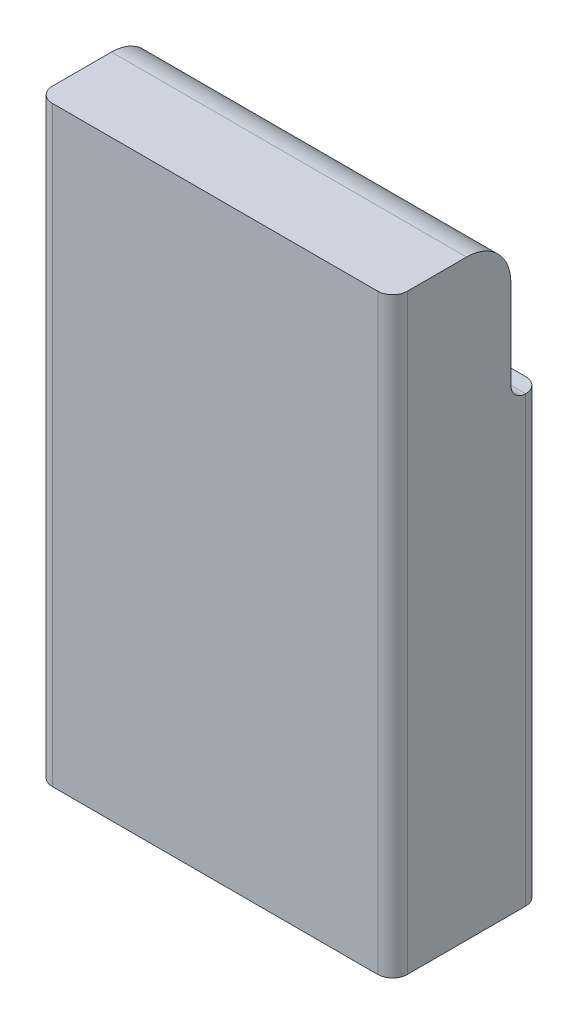
ISO-10303-21;
HEADER;
FILE_DESCRIPTION(('STEP AP214'),'2;1');
FILE_NAME('part.step','',(''),(''),'','','');
FILE_SCHEMA(('AUTOMOTIVE_DESIGN { 1 0 10303 214 1 1 1 1 }'));
ENDSEC;
DATA;
#1=APPLICATION_CONTEXT('core data for automotive mechanical design processes');
#2=APPLICATION_PROTOCOL_DEFINITION('international standard','automotive_design',2000,#1);
#3=PRODUCT_CONTEXT('',#1,'mechanical');
#4=PRODUCT('Part','Part','',(#3));
#5=PRODUCT_RELATED_PRODUCT_CATEGORY('part','',(#4));
#6=PRODUCT_DEFINITION_FORMATION('','',#4);
#7=PRODUCT_DEFINITION_CONTEXT('part definition',#1,'design');
#8=PRODUCT_DEFINITION('design','',#6,#7);
#9=PRODUCT_DEFINITION_SHAPE('','',#8);
#10=(LENGTH_UNIT() NAMED_UNIT(*) SI_UNIT(.MILLI.,.METRE.));
#11=(NAMED_UNIT(*) PLANE_ANGLE_UNIT() SI_UNIT($,.RADIAN.));
#12=(NAMED_UNIT(*) SI_UNIT($,.STERADIAN.) SOLID_ANGLE_UNIT());
#13=UNCERTAINTY_MEASURE_WITH_UNIT(LENGTH_MEASURE(1.E-05),#10,'distance_accuracy_value','');
#14=(GEOMETRIC_REPRESENTATION_CONTEXT(3) GLOBAL_UNCERTAINTY_ASSIGNED_CONTEXT((#13)) GLOBAL_UNIT_ASSIGNED_CONTEXT((#10,
#11,#12)) REPRESENTATION_CONTEXT('',''));
#15=CARTESIAN_POINT('',(0.,0.,0.));
#16=DIRECTION('',(0.,0.,1.));
#17=DIRECTION('',(1.,0.,0.));
#18=AXIS2_PLACEMENT_3D('',#15,#16,#17);
#19=CARTESIAN_POINT('',(12.,-40.,5.));
#20=DIRECTION('',(1.,0.,0.));
#21=DIRECTION('',(0.,0.,-1.));
#22=AXIS2_PLACEMENT_3D('',#19,#20,#21);
#23=PLANE('',#22);
#24=DIRECTION('',(0.,0.,-1.));
#25=VECTOR('',#24,1.);
#26=CARTESIAN_POINT('',(12.,0.,5.));
#27=LINE('',#26,#25);
#28=CARTESIAN_POINT('',(12.,0.,4.));
#29=VERTEX_POINT('',#28);
#30=CARTESIAN_POINT('',(12.,0.,0.));
#31=VERTEX_POINT('',#30);
#32=EDGE_CURVE('E167',#29,#31,#27,.T.);
#33=ORIENTED_EDGE('',*,*,#32,.F.);
#34=DIRECTION('',(0.,1.,0.));
#35=VECTOR('',#34,1.);
#36=CARTESIAN_POINT('',(12.,-40.,4.));
#37=LINE('',#36,#35);
#38=CARTESIAN_POINT('',(12.,-40.,4.));
#39=VERTEX_POINT('',#38);
#40=EDGE_CURVE('E222',#29,#39,#37,.F.);
#41=ORIENTED_EDGE('',*,*,#40,.T.);
#42=DIRECTION('',(0.,0.,-1.));
#43=VECTOR('',#42,1.);
#44=CARTESIAN_POINT('',(12.,-40.,5.));
#45=LINE('',#44,#43);
#46=CARTESIAN_POINT('',(12.,-40.,-4.));
#47=VERTEX_POINT('',#46);
#48=EDGE_CURVE('E168',#39,#47,#45,.T.);
#49=ORIENTED_EDGE('',*,*,#48,.T.);
#50=DIRECTION('',(0.,1.,0.));
#51=VECTOR('',#50,1.);
#52=CARTESIAN_POINT('',(12.,-40.,-4.));
#53=LINE('',#52,#51);
#54=CARTESIAN_POINT('',(12.,-10.,-4.));
#55=VERTEX_POINT('',#54);
#56=EDGE_CURVE('E219',#47,#55,#53,.T.);
#57=ORIENTED_EDGE('',*,*,#56,.T.);
#58=CARTESIAN_POINT('',(12.,-9.,-4.));
#59=DIRECTION('',(1.,0.,0.));
#60=DIRECTION('',(0.,0.,-1.));
#61=AXIS2_PLACEMENT_3D('',#58,#59,#60);
#62=CIRCLE('',#61,0.999999999999999);
#63=CARTESIAN_POINT('',(12.,-9.,-3.));
#64=VERTEX_POINT('',#63);
#65=EDGE_CURVE('E154',#64,#55,#62,.T.);
#66=ORIENTED_EDGE('',*,*,#65,.F.);
#67=DIRECTION('',(0.,-1.,0.));
#68=VECTOR('',#67,1.);
#69=CARTESIAN_POINT('',(12.,0.,-3.));
#70=LINE('',#69,#68);
#71=CARTESIAN_POINT('',(12.,-3.,-3.));
#72=VERTEX_POINT('',#71);
#73=EDGE_CURVE('E146',#72,#64,#70,.T.);
#74=ORIENTED_EDGE('',*,*,#73,.F.);
#75=CARTESIAN_POINT('',(12.,-3.,0.));
#76=DIRECTION('',(1.,0.,0.));
#77=DIRECTION('',(0.,0.,-1.));
#78=AXIS2_PLACEMENT_3D('',#75,#76,#77);
#79=CIRCLE('',#78,3.);
#80=EDGE_CURVE('E190',#72,#31,#79,.T.);
#81=ORIENTED_EDGE('',*,*,#80,.T.);
#82=EDGE_LOOP('',(#33,#41,#49,#57,#66,#74,#81));
#83=FACE_BOUND('',#82,.T.);
#84=ADVANCED_FACE('F51',(#83),#23,.T.);
#85=CARTESIAN_POINT('',(-12.,-40.,5.));
#86=DIRECTION('',(0.,0.,1.));
#87=DIRECTION('',(1.,0.,0.));
#88=AXIS2_PLACEMENT_3D('',#85,#86,#87);
#89=PLANE('',#88);
#90=DIRECTION('',(1.,0.,0.));
#91=VECTOR('',#90,1.);
#92=CARTESIAN_POINT('',(-12.,0.,5.));
#93=LINE('',#92,#91);
#94=CARTESIAN_POINT('',(-11.,0.,5.));
#95=VERTEX_POINT('',#94);
#96=CARTESIAN_POINT('',(11.,0.,5.));
#97=VERTEX_POINT('',#96);
#98=EDGE_CURVE('E172',#95,#97,#93,.T.);
#99=ORIENTED_EDGE('',*,*,#98,.F.);
#100=DIRECTION('',(0.,1.,0.));
#101=VECTOR('',#100,1.);
#102=CARTESIAN_POINT('',(-11.,-40.,5.));
#103=LINE('',#102,#101);
#104=CARTESIAN_POINT('',(-11.,-40.,5.));
#105=VERTEX_POINT('',#104);
#106=EDGE_CURVE('E209',#95,#105,#103,.F.);
#107=ORIENTED_EDGE('',*,*,#106,.T.);
#108=DIRECTION('',(1.,0.,0.));
#109=VECTOR('',#108,1.);
#110=CARTESIAN_POINT('',(-12.,-40.,5.));
#111=LINE('',#110,#109);
#112=CARTESIAN_POINT('',(11.,-40.,5.));
#113=VERTEX_POINT('',#112);
#114=EDGE_CURVE('E178',#105,#113,#111,.T.);
#115=ORIENTED_EDGE('',*,*,#114,.T.);
#116=DIRECTION('',(0.,1.,0.));
#117=VECTOR('',#116,1.);
#118=CARTESIAN_POINT('',(11.,-40.,5.));
#119=LINE('',#118,#117);
#120=EDGE_CURVE('E206',#113,#97,#119,.T.);
#121=ORIENTED_EDGE('',*,*,#120,.T.);
#122=EDGE_LOOP('',(#99,#107,#115,#121));
#123=FACE_BOUND('',#122,.T.);
#124=ADVANCED_FACE('F258',(#123),#89,.T.);
#125=CARTESIAN_POINT('',(-12.,-40.,5.));
#126=DIRECTION('',(-1.,0.,0.));
#127=DIRECTION('',(0.,0.,1.));
#128=AXIS2_PLACEMENT_3D('',#125,#126,#127);
#129=PLANE('',#128);
#130=DIRECTION('',(0.,0.,1.));
#131=VECTOR('',#130,1.);
#132=CARTESIAN_POINT('',(-12.,-40.,5.));
#133=LINE('',#132,#131);
#134=CARTESIAN_POINT('',(-12.,-40.,-4.));
#135=VERTEX_POINT('',#134);
#136=CARTESIAN_POINT('',(-12.,-40.,4.));
#137=VERTEX_POINT('',#136);
#138=EDGE_CURVE('E175',#135,#137,#133,.T.);
#139=ORIENTED_EDGE('',*,*,#138,.T.);
#140=DIRECTION('',(0.,1.,0.));
#141=VECTOR('',#140,1.);
#142=CARTESIAN_POINT('',(-12.,-40.,4.));
#143=LINE('',#142,#141);
#144=CARTESIAN_POINT('',(-12.,0.,4.));
#145=VERTEX_POINT('',#144);
#146=EDGE_CURVE('E199',#137,#145,#143,.T.);
#147=ORIENTED_EDGE('',*,*,#146,.T.);
#148=DIRECTION('',(0.,0.,1.));
#149=VECTOR('',#148,1.);
#150=CARTESIAN_POINT('',(-12.,0.,5.));
#151=LINE('',#150,#149);
#152=CARTESIAN_POINT('',(-12.,0.,0.));
#153=VERTEX_POINT('',#152);
#154=EDGE_CURVE('E183',#153,#145,#151,.T.);
#155=ORIENTED_EDGE('',*,*,#154,.F.);
#156=CARTESIAN_POINT('',(-12.,-3.,0.));
#157=DIRECTION('',(-1.,0.,0.));
#158=DIRECTION('',(0.,0.,1.));
#159=AXIS2_PLACEMENT_3D('',#156,#157,#158);
#160=CIRCLE('',#159,3.);
#161=CARTESIAN_POINT('',(-12.,-3.,-3.));
#162=VERTEX_POINT('',#161);
#163=EDGE_CURVE('E195',#153,#162,#160,.T.);
#164=ORIENTED_EDGE('',*,*,#163,.T.);
#165=DIRECTION('',(0.,-1.,0.));
#166=VECTOR('',#165,1.);
#167=CARTESIAN_POINT('',(-12.,0.,-3.));
#168=LINE('',#167,#166);
#169=CARTESIAN_POINT('',(-12.,-9.,-3.));
#170=VERTEX_POINT('',#169);
#171=EDGE_CURVE('E143',#162,#170,#168,.T.);
#172=ORIENTED_EDGE('',*,*,#171,.T.);
#173=CARTESIAN_POINT('',(-12.,-9.,-4.));
#174=DIRECTION('',(-1.,0.,0.));
#175=DIRECTION('',(0.,0.,1.));
#176=AXIS2_PLACEMENT_3D('',#173,#174,#175);
#177=CIRCLE('',#176,0.999999999999999);
#178=CARTESIAN_POINT('',(-12.,-10.,-4.));
#179=VERTEX_POINT('',#178);
#180=EDGE_CURVE('E160',#170,#179,#177,.F.);
#181=ORIENTED_EDGE('',*,*,#180,.T.);
#182=DIRECTION('',(0.,1.,0.));
#183=VECTOR('',#182,1.);
#184=CARTESIAN_POINT('',(-12.,-40.,-4.));
#185=LINE('',#184,#183);
#186=EDGE_CURVE('E197',#179,#135,#185,.F.);
#187=ORIENTED_EDGE('',*,*,#186,.T.);
#188=EDGE_LOOP('',(#139,#147,#155,#164,#172,#181,#187));
#189=FACE_BOUND('',#188,.T.);
#190=ADVANCED_FACE('F240',(#189),#129,.T.);
#191=CARTESIAN_POINT('',(-12.,-40.,-5.));
#192=DIRECTION('',(0.,0.,-1.));
#193=DIRECTION('',(-1.,0.,0.));
#194=AXIS2_PLACEMENT_3D('',#191,#192,#193);
#195=PLANE('',#194);
#196=DIRECTION('',(-1.,0.,0.));
#197=VECTOR('',#196,1.);
#198=CARTESIAN_POINT('',(-12.,-40.,-5.));
#199=LINE('',#198,#197);
#200=CARTESIAN_POINT('',(11.,-40.,-5.));
#201=VERTEX_POINT('',#200);
#202=CARTESIAN_POINT('',(-11.,-40.,-5.));
#203=VERTEX_POINT('',#202);
#204=EDGE_CURVE('E171',#201,#203,#199,.T.);
#205=ORIENTED_EDGE('',*,*,#204,.T.);
#206=DIRECTION('',(0.,1.,0.));
#207=VECTOR('',#206,1.);
#208=CARTESIAN_POINT('',(-11.,-40.,-5.));
#209=LINE('',#208,#207);
#210=CARTESIAN_POINT('',(-11.,-10.,-5.));
#211=VERTEX_POINT('',#210);
#212=EDGE_CURVE('E226',#203,#211,#209,.T.);
#213=ORIENTED_EDGE('',*,*,#212,.T.);
#214=DIRECTION('',(1.,0.,0.));
#215=VECTOR('',#214,1.);
#216=CARTESIAN_POINT('',(-12.001,-10.,-5.));
#217=LINE('',#216,#215);
#218=CARTESIAN_POINT('',(11.,-10.,-5.));
#219=VERTEX_POINT('',#218);
#220=EDGE_CURVE('E158',#211,#219,#217,.T.);
#221=ORIENTED_EDGE('',*,*,#220,.T.);
#222=DIRECTION('',(0.,1.,0.));
#223=VECTOR('',#222,1.);
#224=CARTESIAN_POINT('',(11.,-40.,-5.));
#225=LINE('',#224,#223);
#226=EDGE_CURVE('E224',#219,#201,#225,.F.);
#227=ORIENTED_EDGE('',*,*,#226,.T.);
#228=EDGE_LOOP('',(#205,#213,#221,#227));
#229=FACE_BOUND('',#228,.T.);
#230=ADVANCED_FACE('F228',(#229),#195,.T.);
#231=CARTESIAN_POINT('',(0.,-40.,0.));
#232=DIRECTION('',(0.,-1.,0.));
#233=DIRECTION('',(0.,0.,-1.));
#234=AXIS2_PLACEMENT_3D('',#231,#232,#233);
#235=PLANE('',#234);
#236=CARTESIAN_POINT('',(0.,-40.,0.));
#237=DIRECTION('',(0.,-1.,0.));
#238=DIRECTION('',(0.,0.,-1.));
#239=AXIS2_PLACEMENT_3D('',#236,#237,#238);
#240=CIRCLE('',#239,3.025);
#241=CARTESIAN_POINT('',(0.,-40.,-3.025));
#242=VERTEX_POINT('',#241);
#243=EDGE_CURVE('E149',#242,#242,#240,.T.);
#244=ORIENTED_EDGE('',*,*,#243,.F.);
#245=EDGE_LOOP('',(#244));
#246=FACE_BOUND('',#245,.T.);
#247=ORIENTED_EDGE('',*,*,#114,.F.);
#248=CARTESIAN_POINT('',(-11.,-40.,4.));
#249=DIRECTION('',(0.,-1.,0.));
#250=DIRECTION('',(0.,0.,-1.));
#251=AXIS2_PLACEMENT_3D('',#248,#249,#250);
#252=CIRCLE('',#251,1.);
#253=EDGE_CURVE('E217',#105,#137,#252,.T.);
#254=ORIENTED_EDGE('',*,*,#253,.T.);
#255=ORIENTED_EDGE('',*,*,#138,.F.);
#256=CARTESIAN_POINT('',(-11.,-40.,-4.));
#257=DIRECTION('',(0.,-1.,0.));
#258=DIRECTION('',(0.,0.,-1.));
#259=AXIS2_PLACEMENT_3D('',#256,#257,#258);
#260=CIRCLE('',#259,1.);
#261=EDGE_CURVE('E213',#135,#203,#260,.T.);
#262=ORIENTED_EDGE('',*,*,#261,.T.);
#263=ORIENTED_EDGE('',*,*,#204,.F.);
#264=CARTESIAN_POINT('',(11.,-40.,-4.));
#265=DIRECTION('',(0.,-1.,0.));
#266=DIRECTION('',(0.,0.,-1.));
#267=AXIS2_PLACEMENT_3D('',#264,#265,#266);
#268=CIRCLE('',#267,1.);
#269=EDGE_CURVE('E211',#201,#47,#268,.T.);
#270=ORIENTED_EDGE('',*,*,#269,.T.);
#271=ORIENTED_EDGE('',*,*,#48,.F.);
#272=CARTESIAN_POINT('',(11.,-40.,4.));
#273=DIRECTION('',(0.,-1.,0.));
#274=DIRECTION('',(0.,0.,-1.));
#275=AXIS2_PLACEMENT_3D('',#272,#273,#274);
#276=CIRCLE('',#275,1.);
#277=EDGE_CURVE('E215',#39,#113,#276,.T.);
#278=ORIENTED_EDGE('',*,*,#277,.T.);
#279=EDGE_LOOP('',(#247,#254,#255,#262,#263,#270,#271,#278));
#280=FACE_BOUND('',#279,.T.);
#281=ADVANCED_FACE('F246',(#246,#280),#235,.T.);
#282=CARTESIAN_POINT('',(0.,0.,0.));
#283=DIRECTION('',(0.,-1.,0.));
#284=DIRECTION('',(0.,0.,-1.));
#285=AXIS2_PLACEMENT_3D('',#282,#283,#284);
#286=PLANE('',#285);
#287=ORIENTED_EDGE('',*,*,#154,.T.);
#288=CARTESIAN_POINT('',(-11.,0.,4.));
#289=DIRECTION('',(0.,-1.,0.));
#290=DIRECTION('',(0.,0.,-1.));
#291=AXIS2_PLACEMENT_3D('',#288,#289,#290);
#292=CIRCLE('',#291,1.);
#293=EDGE_CURVE('E204',#145,#95,#292,.F.);
#294=ORIENTED_EDGE('',*,*,#293,.T.);
#295=ORIENTED_EDGE('',*,*,#98,.T.);
#296=CARTESIAN_POINT('',(11.,0.,4.));
#297=DIRECTION('',(0.,-1.,0.));
#298=DIRECTION('',(0.,0.,-1.));
#299=AXIS2_PLACEMENT_3D('',#296,#297,#298);
#300=CIRCLE('',#299,1.);
#301=EDGE_CURVE('E202',#97,#29,#300,.F.);
#302=ORIENTED_EDGE('',*,*,#301,.T.);
#303=ORIENTED_EDGE('',*,*,#32,.T.);
#304=DIRECTION('',(1.,0.,0.));
#305=VECTOR('',#304,1.);
#306=CARTESIAN_POINT('',(0.,0.,0.));
#307=LINE('',#306,#305);
#308=EDGE_CURVE('E193',#31,#153,#307,.F.);
#309=ORIENTED_EDGE('',*,*,#308,.T.);
#310=EDGE_LOOP('',(#287,#294,#295,#302,#303,#309));
#311=FACE_BOUND('',#310,.T.);
#312=ADVANCED_FACE('F256',(#311),#286,.F.);
#313=CARTESIAN_POINT('',(-12.001,0.,-3.));
#314=DIRECTION('',(0.,0.,1.));
#315=DIRECTION('',(0.,-1.,0.));
#316=AXIS2_PLACEMENT_3D('',#313,#314,#315);
#317=PLANE('',#316);
#318=ORIENTED_EDGE('',*,*,#171,.F.);
#319=DIRECTION('',(1.,0.,0.));
#320=VECTOR('',#319,1.);
#321=CARTESIAN_POINT('',(-12.001,-3.,-3.));
#322=LINE('',#321,#320);
#323=EDGE_CURVE('E181',#162,#72,#322,.T.);
#324=ORIENTED_EDGE('',*,*,#323,.T.);
#325=ORIENTED_EDGE('',*,*,#73,.T.);
#326=DIRECTION('',(1.,0.,0.));
#327=VECTOR('',#326,1.);
#328=CARTESIAN_POINT('',(-12.001,-9.,-3.));
#329=LINE('',#328,#327);
#330=EDGE_CURVE('E157',#170,#64,#329,.T.);
#331=ORIENTED_EDGE('',*,*,#330,.F.);
#332=EDGE_LOOP('',(#318,#324,#325,#331));
#333=FACE_BOUND('',#332,.T.);
#334=ADVANCED_FACE('F274',(#333),#317,.F.);
#335=CARTESIAN_POINT('',(-12.001,-10.,-4.));
#336=DIRECTION('',(0.,-1.,0.));
#337=DIRECTION('',(0.,0.,-1.));
#338=AXIS2_PLACEMENT_3D('',#335,#336,#337);
#339=PLANE('',#338);
#340=ORIENTED_EDGE('',*,*,#220,.F.);
#341=CARTESIAN_POINT('',(-11.,-10.,-4.));
#342=DIRECTION('',(0.,-1.,0.));
#343=DIRECTION('',(0.,0.,-1.));
#344=AXIS2_PLACEMENT_3D('',#341,#342,#343);
#345=CIRCLE('',#344,1.);
#346=EDGE_CURVE('E11',#211,#179,#345,.F.);
#347=ORIENTED_EDGE('',*,*,#346,.T.);
#348=DIRECTION('',(1.,0.,0.));
#349=VECTOR('',#348,1.);
#350=CARTESIAN_POINT('',(-12.001,-10.,-4.));
#351=LINE('',#350,#349);
#352=EDGE_CURVE('E161',#179,#55,#351,.T.);
#353=ORIENTED_EDGE('',*,*,#352,.T.);
#354=CARTESIAN_POINT('',(11.,-10.,-4.));
#355=DIRECTION('',(0.,-1.,0.));
#356=DIRECTION('',(0.,0.,-1.));
#357=AXIS2_PLACEMENT_3D('',#354,#355,#356);
#358=CIRCLE('',#357,1.);
#359=EDGE_CURVE('E59',#55,#219,#358,.F.);
#360=ORIENTED_EDGE('',*,*,#359,.T.);
#361=EDGE_LOOP('',(#340,#347,#353,#360));
#362=FACE_BOUND('',#361,.T.);
#363=ADVANCED_FACE('F232',(#362),#339,.F.);
#364=CARTESIAN_POINT('',(-12.001,-9.,-4.));
#365=DIRECTION('',(1.,0.,0.));
#366=DIRECTION('',(0.,0.,-1.));
#367=AXIS2_PLACEMENT_3D('',#364,#365,#366);
#368=CYLINDRICAL_SURFACE('',#367,0.999999999999999);
#369=ORIENTED_EDGE('',*,*,#330,.T.);
#370=ORIENTED_EDGE('',*,*,#65,.T.);
#371=ORIENTED_EDGE('',*,*,#352,.F.);
#372=ORIENTED_EDGE('',*,*,#180,.F.);
#373=EDGE_LOOP('',(#369,#370,#371,#372));
#374=FACE_BOUND('',#373,.T.);
#375=ADVANCED_FACE('F236',(#374),#368,.F.);
#376=CARTESIAN_POINT('',(-12.001,-3.,0.));
#377=DIRECTION('',(1.,0.,0.));
#378=DIRECTION('',(0.,0.,-1.));
#379=AXIS2_PLACEMENT_3D('',#376,#377,#378);
#380=CYLINDRICAL_SURFACE('',#379,3.);
#381=ORIENTED_EDGE('',*,*,#163,.F.);
#382=ORIENTED_EDGE('',*,*,#308,.F.);
#383=ORIENTED_EDGE('',*,*,#80,.F.);
#384=ORIENTED_EDGE('',*,*,#323,.F.);
#385=EDGE_LOOP('',(#381,#382,#383,#384));
#386=FACE_BOUND('',#385,.T.);
#387=ADVANCED_FACE('F272',(#386),#380,.T.);
#388=CARTESIAN_POINT('',(-11.,-40.,4.));
#389=DIRECTION('',(0.,1.,0.));
#390=DIRECTION('',(0.,0.,1.));
#391=AXIS2_PLACEMENT_3D('',#388,#389,#390);
#392=CYLINDRICAL_SURFACE('',#391,1.);
#393=ORIENTED_EDGE('',*,*,#253,.F.);
#394=ORIENTED_EDGE('',*,*,#106,.F.);
#395=ORIENTED_EDGE('',*,*,#293,.F.);
#396=ORIENTED_EDGE('',*,*,#146,.F.);
#397=EDGE_LOOP('',(#393,#394,#395,#396));
#398=FACE_BOUND('',#397,.T.);
#399=ADVANCED_FACE('F252',(#398),#392,.T.);
#400=CARTESIAN_POINT('',(11.,-40.,4.));
#401=DIRECTION('',(0.,1.,0.));
#402=DIRECTION('',(0.,0.,1.));
#403=AXIS2_PLACEMENT_3D('',#400,#401,#402);
#404=CYLINDRICAL_SURFACE('',#403,1.);
#405=ORIENTED_EDGE('',*,*,#277,.F.);
#406=ORIENTED_EDGE('',*,*,#40,.F.);
#407=ORIENTED_EDGE('',*,*,#301,.F.);
#408=ORIENTED_EDGE('',*,*,#120,.F.);
#409=EDGE_LOOP('',(#405,#406,#407,#408));
#410=FACE_BOUND('',#409,.T.);
#411=ADVANCED_FACE('F262',(#410),#404,.T.);
#412=CARTESIAN_POINT('',(-11.,-40.,-4.));
#413=DIRECTION('',(0.,1.,0.));
#414=DIRECTION('',(0.,0.,1.));
#415=AXIS2_PLACEMENT_3D('',#412,#413,#414);
#416=CYLINDRICAL_SURFACE('',#415,1.);
#417=ORIENTED_EDGE('',*,*,#261,.F.);
#418=ORIENTED_EDGE('',*,*,#186,.F.);
#419=ORIENTED_EDGE('',*,*,#346,.F.);
#420=ORIENTED_EDGE('',*,*,#212,.F.);
#421=EDGE_LOOP('',(#417,#418,#419,#420));
#422=FACE_BOUND('',#421,.T.);
#423=ADVANCED_FACE('F243',(#422),#416,.T.);
#424=CARTESIAN_POINT('',(11.,-40.,-4.));
#425=DIRECTION('',(0.,1.,0.));
#426=DIRECTION('',(0.,0.,1.));
#427=AXIS2_PLACEMENT_3D('',#424,#425,#426);
#428=CYLINDRICAL_SURFACE('',#427,1.);
#429=ORIENTED_EDGE('',*,*,#269,.F.);
#430=ORIENTED_EDGE('',*,*,#226,.F.);
#431=ORIENTED_EDGE('',*,*,#359,.F.);
#432=ORIENTED_EDGE('',*,*,#56,.F.);
#433=EDGE_LOOP('',(#429,#430,#431,#432));
#434=FACE_BOUND('',#433,.T.);
#435=ADVANCED_FACE('F53',(#434),#428,.T.);
#436=CARTESIAN_POINT('',(0.,-23.,0.));
#437=DIRECTION('',(0.,-1.,0.));
#438=DIRECTION('',(0.,0.,-1.));
#439=AXIS2_PLACEMENT_3D('',#436,#437,#438);
#440=CONICAL_SURFACE('',#439,2.5,1.02974425867665);
#441=CARTESIAN_POINT('',(0.,-21.4978484524311,0.));
#442=VERTEX_POINT('',#441);
#443=VERTEX_LOOP('',#442);
#444=FACE_BOUND('',#443,.T.);
#445=CARTESIAN_POINT('',(0.,-23.,0.));
#446=DIRECTION('',(0.,-1.,0.));
#447=DIRECTION('',(0.,0.,-1.));
#448=AXIS2_PLACEMENT_3D('',#445,#446,#447);
#449=CIRCLE('',#448,2.5);
#450=CARTESIAN_POINT('',(0.,-23.,-2.5));
#451=VERTEX_POINT('',#450);
#452=EDGE_CURVE('E141',#451,#451,#449,.T.);
#453=ORIENTED_EDGE('',*,*,#452,.T.);
#454=EDGE_LOOP('',(#453));
#455=FACE_BOUND('',#454,.T.);
#456=ADVANCED_FACE('F134',(#444,#455),#440,.F.);
#457=CARTESIAN_POINT('',(0.,-40.,0.));
#458=DIRECTION('',(0.,-1.,0.));
#459=DIRECTION('',(0.,0.,-1.));
#460=AXIS2_PLACEMENT_3D('',#457,#458,#459);
#461=CYLINDRICAL_SURFACE('',#460,2.5);
#462=ORIENTED_EDGE('',*,*,#452,.F.);
#463=EDGE_LOOP('',(#462));
#464=FACE_BOUND('',#463,.T.);
#465=CARTESIAN_POINT('',(0.,-39.475,0.));
#466=DIRECTION('',(0.,-1.,0.));
#467=DIRECTION('',(0.,0.,-1.));
#468=AXIS2_PLACEMENT_3D('',#465,#466,#467);
#469=CIRCLE('',#468,2.5);
#470=CARTESIAN_POINT('',(0.,-39.475,-2.5));
#471=VERTEX_POINT('',#470);
#472=EDGE_CURVE('E144',#471,#471,#469,.T.);
#473=ORIENTED_EDGE('',*,*,#472,.T.);
#474=EDGE_LOOP('',(#473));
#475=FACE_BOUND('',#474,.T.);
#476=ADVANCED_FACE('F137',(#464,#475),#461,.F.);
#477=CARTESIAN_POINT('',(0.,-40.,0.));
#478=DIRECTION('',(0.,-1.,0.));
#479=DIRECTION('',(0.,0.,-1.));
#480=AXIS2_PLACEMENT_3D('',#477,#478,#479);
#481=CONICAL_SURFACE('',#480,3.025,0.785398163397445);
#482=ORIENTED_EDGE('',*,*,#472,.F.);
#483=EDGE_LOOP('',(#482));
#484=FACE_BOUND('',#483,.T.);
#485=ORIENTED_EDGE('',*,*,#243,.T.);
#486=EDGE_LOOP('',(#485));
#487=FACE_BOUND('',#486,.T.);
#488=ADVANCED_FACE('F327',(#484,#487),#481,.F.);
#489=CLOSED_SHELL('',(#84,#124,#190,#230,#281,#312,#334,#363,#375,#387,#399,#411,#423,#435,#456,
#476,#488));
#490=MANIFOLD_SOLID_BREP('B2',#489);
#491=ADVANCED_BREP_SHAPE_REPRESENTATION('',(#18,#490),#14);
#492=SHAPE_DEFINITION_REPRESENTATION(#9,#491);
ENDSEC;
END-ISO-10303-21;
